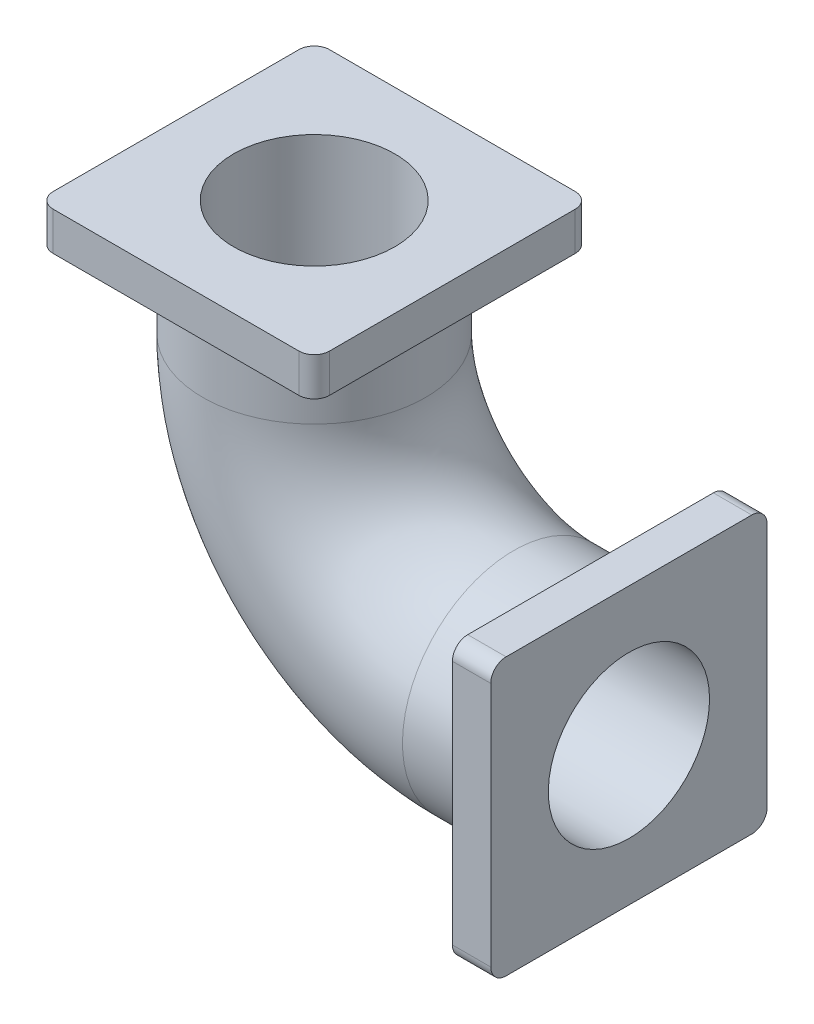
ISO-10303-21;
HEADER;
FILE_DESCRIPTION(('STEP AP214'),'2;1');
FILE_NAME('part.step','',(''),(''),'','','');
FILE_SCHEMA(('AUTOMOTIVE_DESIGN { 1 0 10303 214 1 1 1 1 }'));
ENDSEC;
DATA;
#1=APPLICATION_CONTEXT('core data for automotive mechanical design processes');
#2=APPLICATION_PROTOCOL_DEFINITION('international standard','automotive_design',2000,#1);
#3=PRODUCT_CONTEXT('',#1,'mechanical');
#4=PRODUCT('Part','Part','',(#3));
#5=PRODUCT_RELATED_PRODUCT_CATEGORY('part','',(#4));
#6=PRODUCT_DEFINITION_FORMATION('','',#4);
#7=PRODUCT_DEFINITION_CONTEXT('part definition',#1,'design');
#8=PRODUCT_DEFINITION('design','',#6,#7);
#9=PRODUCT_DEFINITION_SHAPE('','',#8);
#10=(LENGTH_UNIT() NAMED_UNIT(*) SI_UNIT(.MILLI.,.METRE.));
#11=(NAMED_UNIT(*) PLANE_ANGLE_UNIT() SI_UNIT($,.RADIAN.));
#12=(NAMED_UNIT(*) SI_UNIT($,.STERADIAN.) SOLID_ANGLE_UNIT());
#13=UNCERTAINTY_MEASURE_WITH_UNIT(LENGTH_MEASURE(1.E-05),#10,'distance_accuracy_value','');
#14=(GEOMETRIC_REPRESENTATION_CONTEXT(3) GLOBAL_UNCERTAINTY_ASSIGNED_CONTEXT((#13)) GLOBAL_UNIT_ASSIGNED_CONTEXT((#10,
#11,#12)) REPRESENTATION_CONTEXT('',''));
#15=CARTESIAN_POINT('',(0.,0.,0.));
#16=DIRECTION('',(0.,0.,1.));
#17=DIRECTION('',(1.,0.,0.));
#18=AXIS2_PLACEMENT_3D('',#15,#16,#17);
#19=CARTESIAN_POINT('',(-410.,260.,0.));
#20=DIRECTION('',(0.,1.,0.));
#21=DIRECTION('',(-1.,0.,0.));
#22=AXIS2_PLACEMENT_3D('',#19,#20,#21);
#23=CYLINDRICAL_SURFACE('',#22,145.);
#24=CARTESIAN_POINT('',(-410.,260.,0.));
#25=DIRECTION('',(0.,-1.,0.));
#26=DIRECTION('',(0.,0.,-1.));
#27=AXIS2_PLACEMENT_3D('',#24,#25,#26);
#28=CIRCLE('',#27,145.);
#29=CARTESIAN_POINT('',(-555.,260.,0.));
#30=VERTEX_POINT('',#29);
#31=EDGE_CURVE('E188',#30,#30,#28,.T.);
#32=ORIENTED_EDGE('',*,*,#31,.F.);
#33=EDGE_LOOP('',(#32));
#34=FACE_BOUND('',#33,.T.);
#35=CARTESIAN_POINT('',(-410.,360.,0.));
#36=DIRECTION('',(0.,1.,0.));
#37=DIRECTION('',(-1.,0.,0.));
#38=AXIS2_PLACEMENT_3D('',#35,#36,#37);
#39=CIRCLE('',#38,145.);
#40=CARTESIAN_POINT('',(-555.,360.,0.));
#41=VERTEX_POINT('',#40);
#42=EDGE_CURVE('E216',#41,#41,#39,.T.);
#43=ORIENTED_EDGE('',*,*,#42,.F.);
#44=EDGE_LOOP('',(#43));
#45=FACE_BOUND('',#44,.T.);
#46=ADVANCED_FACE('F41',(#34,#45),#23,.T.);
#47=CARTESIAN_POINT('',(0.,0.,0.));
#48=DIRECTION('',(-1.,0.,0.));
#49=DIRECTION('',(0.,0.,1.));
#50=AXIS2_PLACEMENT_3D('',#47,#48,#49);
#51=CYLINDRICAL_SURFACE('',#50,145.);
#52=CARTESIAN_POINT('',(-150.,0.,0.));
#53=DIRECTION('',(1.,0.,0.));
#54=DIRECTION('',(0.,0.,-1.));
#55=AXIS2_PLACEMENT_3D('',#52,#53,#54);
#56=CIRCLE('',#55,145.);
#57=CARTESIAN_POINT('',(-150.,-145.,0.));
#58=VERTEX_POINT('',#57);
#59=EDGE_CURVE('E310',#58,#58,#56,.T.);
#60=ORIENTED_EDGE('',*,*,#59,.T.);
#61=EDGE_LOOP('',(#60));
#62=FACE_BOUND('',#61,.T.);
#63=CARTESIAN_POINT('',(-50.,0.,0.));
#64=DIRECTION('',(1.,0.,0.));
#65=DIRECTION('',(0.,0.,-1.));
#66=AXIS2_PLACEMENT_3D('',#63,#64,#65);
#67=CIRCLE('',#66,145.);
#68=CARTESIAN_POINT('',(-50.,0.,-145.));
#69=VERTEX_POINT('',#68);
#70=EDGE_CURVE('E183',#69,#69,#67,.T.);
#71=ORIENTED_EDGE('',*,*,#70,.F.);
#72=EDGE_LOOP('',(#71));
#73=FACE_BOUND('',#72,.T.);
#74=ADVANCED_FACE('F320',(#62,#73),#51,.T.);
#75=CARTESIAN_POINT('',(0.,0.,0.));
#76=DIRECTION('',(1.,0.,0.));
#77=DIRECTION('',(0.,0.,-1.));
#78=AXIS2_PLACEMENT_3D('',#75,#76,#77);
#79=PLANE('',#78);
#80=CARTESIAN_POINT('',(0.,0.,0.));
#81=DIRECTION('',(1.,0.,0.));
#82=DIRECTION('',(0.,0.,-1.));
#83=AXIS2_PLACEMENT_3D('',#80,#81,#82);
#84=CIRCLE('',#83,105.);
#85=CARTESIAN_POINT('',(0.,0.,-105.));
#86=VERTEX_POINT('',#85);
#87=EDGE_CURVE('E291',#86,#86,#84,.T.);
#88=ORIENTED_EDGE('',*,*,#87,.F.);
#89=EDGE_LOOP('',(#88));
#90=FACE_BOUND('',#89,.T.);
#91=DIRECTION('',(0.,0.,-1.));
#92=VECTOR('',#91,1.);
#93=CARTESIAN_POINT('',(0.,-180.,0.));
#94=LINE('',#93,#92);
#95=CARTESIAN_POINT('',(0.,-180.,160.));
#96=VERTEX_POINT('',#95);
#97=CARTESIAN_POINT('',(0.,-180.,-160.));
#98=VERTEX_POINT('',#97);
#99=EDGE_CURVE('E159',#96,#98,#94,.T.);
#100=ORIENTED_EDGE('',*,*,#99,.T.);
#101=CARTESIAN_POINT('',(0.,-160.,-160.));
#102=DIRECTION('',(1.,0.,0.));
#103=DIRECTION('',(0.,0.,-1.));
#104=AXIS2_PLACEMENT_3D('',#101,#102,#103);
#105=CIRCLE('',#104,20.);
#106=CARTESIAN_POINT('',(0.,-160.,-180.));
#107=VERTEX_POINT('',#106);
#108=EDGE_CURVE('E166',#98,#107,#105,.T.);
#109=ORIENTED_EDGE('',*,*,#108,.T.);
#110=DIRECTION('',(0.,1.,0.));
#111=VECTOR('',#110,1.);
#112=CARTESIAN_POINT('',(0.,0.,-180.));
#113=LINE('',#112,#111);
#114=CARTESIAN_POINT('',(0.,160.,-180.));
#115=VERTEX_POINT('',#114);
#116=EDGE_CURVE('E177',#107,#115,#113,.T.);
#117=ORIENTED_EDGE('',*,*,#116,.T.);
#118=CARTESIAN_POINT('',(0.,160.,-160.));
#119=DIRECTION('',(1.,0.,0.));
#120=DIRECTION('',(0.,0.,-1.));
#121=AXIS2_PLACEMENT_3D('',#118,#119,#120);
#122=CIRCLE('',#121,20.);
#123=CARTESIAN_POINT('',(0.,180.,-160.));
#124=VERTEX_POINT('',#123);
#125=EDGE_CURVE('E167',#115,#124,#122,.T.);
#126=ORIENTED_EDGE('',*,*,#125,.T.);
#127=DIRECTION('',(0.,0.,-1.));
#128=VECTOR('',#127,1.);
#129=CARTESIAN_POINT('',(0.,180.,0.));
#130=LINE('',#129,#128);
#131=CARTESIAN_POINT('',(0.,180.,160.));
#132=VERTEX_POINT('',#131);
#133=EDGE_CURVE('E295',#132,#124,#130,.T.);
#134=ORIENTED_EDGE('',*,*,#133,.F.);
#135=CARTESIAN_POINT('',(0.,160.,160.));
#136=DIRECTION('',(1.,0.,0.));
#137=DIRECTION('',(0.,0.,-1.));
#138=AXIS2_PLACEMENT_3D('',#135,#136,#137);
#139=CIRCLE('',#138,20.);
#140=CARTESIAN_POINT('',(0.,160.,180.));
#141=VERTEX_POINT('',#140);
#142=EDGE_CURVE('E185',#132,#141,#139,.T.);
#143=ORIENTED_EDGE('',*,*,#142,.T.);
#144=DIRECTION('',(0.,1.,0.));
#145=VECTOR('',#144,1.);
#146=CARTESIAN_POINT('',(0.,0.,180.));
#147=LINE('',#146,#145);
#148=CARTESIAN_POINT('',(0.,-160.,180.));
#149=VERTEX_POINT('',#148);
#150=EDGE_CURVE('E161',#149,#141,#147,.T.);
#151=ORIENTED_EDGE('',*,*,#150,.F.);
#152=CARTESIAN_POINT('',(0.,-160.,160.));
#153=DIRECTION('',(1.,0.,0.));
#154=DIRECTION('',(0.,0.,-1.));
#155=AXIS2_PLACEMENT_3D('',#152,#153,#154);
#156=CIRCLE('',#155,20.);
#157=EDGE_CURVE('E156',#149,#96,#156,.T.);
#158=ORIENTED_EDGE('',*,*,#157,.T.);
#159=EDGE_LOOP('',(#100,#109,#117,#126,#134,#143,#151,#158));
#160=FACE_BOUND('',#159,.T.);
#161=ADVANCED_FACE('F158',(#90,#160),#79,.T.);
#162=CARTESIAN_POINT('',(-410.,410.,0.));
#163=DIRECTION('',(0.,-1.,0.));
#164=DIRECTION('',(0.,0.,-1.));
#165=AXIS2_PLACEMENT_3D('',#162,#163,#164);
#166=PLANE('',#165);
#167=CARTESIAN_POINT('',(-410.,410.,0.));
#168=DIRECTION('',(0.,-1.,0.));
#169=DIRECTION('',(1.,0.,0.));
#170=AXIS2_PLACEMENT_3D('',#167,#168,#169);
#171=CIRCLE('',#170,105.);
#172=CARTESIAN_POINT('',(-305.,410.,0.));
#173=VERTEX_POINT('',#172);
#174=EDGE_CURVE('E305',#173,#173,#171,.T.);
#175=ORIENTED_EDGE('',*,*,#174,.T.);
#176=EDGE_LOOP('',(#175));
#177=FACE_BOUND('',#176,.T.);
#178=DIRECTION('',(0.,0.,-1.));
#179=VECTOR('',#178,1.);
#180=CARTESIAN_POINT('',(-590.,410.,3.63906435849357E-13));
#181=LINE('',#180,#179);
#182=CARTESIAN_POINT('',(-590.,410.,160.));
#183=VERTEX_POINT('',#182);
#184=CARTESIAN_POINT('',(-590.,410.,-160.));
#185=VERTEX_POINT('',#184);
#186=EDGE_CURVE('E273',#183,#185,#181,.T.);
#187=ORIENTED_EDGE('',*,*,#186,.F.);
#188=CARTESIAN_POINT('',(-570.,410.,160.));
#189=DIRECTION('',(0.,-1.,0.));
#190=DIRECTION('',(1.,0.,0.));
#191=AXIS2_PLACEMENT_3D('',#188,#189,#190);
#192=CIRCLE('',#191,20.);
#193=CARTESIAN_POINT('',(-570.,410.,180.));
#194=VERTEX_POINT('',#193);
#195=EDGE_CURVE('E230',#183,#194,#192,.F.);
#196=ORIENTED_EDGE('',*,*,#195,.T.);
#197=DIRECTION('',(1.,0.,0.));
#198=VECTOR('',#197,1.);
#199=CARTESIAN_POINT('',(1.7235944623182E-13,410.,180.));
#200=LINE('',#199,#198);
#201=CARTESIAN_POINT('',(-250.,410.,180.));
#202=VERTEX_POINT('',#201);
#203=EDGE_CURVE('E271',#194,#202,#200,.T.);
#204=ORIENTED_EDGE('',*,*,#203,.T.);
#205=CARTESIAN_POINT('',(-250.,410.,160.));
#206=DIRECTION('',(0.,-1.,0.));
#207=DIRECTION('',(1.,0.,0.));
#208=AXIS2_PLACEMENT_3D('',#205,#206,#207);
#209=CIRCLE('',#208,20.);
#210=CARTESIAN_POINT('',(-230.,410.,160.));
#211=VERTEX_POINT('',#210);
#212=EDGE_CURVE('E228',#202,#211,#209,.F.);
#213=ORIENTED_EDGE('',*,*,#212,.T.);
#214=DIRECTION('',(0.,0.,-1.));
#215=VECTOR('',#214,1.);
#216=CARTESIAN_POINT('',(-230.,410.,0.));
#217=LINE('',#216,#215);
#218=CARTESIAN_POINT('',(-230.,410.,-160.));
#219=VERTEX_POINT('',#218);
#220=EDGE_CURVE('E266',#211,#219,#217,.T.);
#221=ORIENTED_EDGE('',*,*,#220,.T.);
#222=CARTESIAN_POINT('',(-250.,410.,-160.));
#223=DIRECTION('',(0.,-1.,0.));
#224=DIRECTION('',(1.,0.,0.));
#225=AXIS2_PLACEMENT_3D('',#222,#223,#224);
#226=CIRCLE('',#225,20.);
#227=CARTESIAN_POINT('',(-250.,410.,-180.));
#228=VERTEX_POINT('',#227);
#229=EDGE_CURVE('E224',#219,#228,#226,.F.);
#230=ORIENTED_EDGE('',*,*,#229,.T.);
#231=DIRECTION('',(1.,0.,0.));
#232=VECTOR('',#231,1.);
#233=CARTESIAN_POINT('',(1.7235944623182E-13,410.,-180.));
#234=LINE('',#233,#232);
#235=CARTESIAN_POINT('',(-570.,410.,-180.));
#236=VERTEX_POINT('',#235);
#237=EDGE_CURVE('E255',#236,#228,#234,.T.);
#238=ORIENTED_EDGE('',*,*,#237,.F.);
#239=CARTESIAN_POINT('',(-570.,410.,-160.));
#240=DIRECTION('',(0.,-1.,0.));
#241=DIRECTION('',(1.,0.,0.));
#242=AXIS2_PLACEMENT_3D('',#239,#240,#241);
#243=CIRCLE('',#242,20.);
#244=EDGE_CURVE('E226',#236,#185,#243,.F.);
#245=ORIENTED_EDGE('',*,*,#244,.T.);
#246=EDGE_LOOP('',(#187,#196,#204,#213,#221,#230,#238,#245));
#247=FACE_BOUND('',#246,.T.);
#248=ADVANCED_FACE('F269',(#177,#247),#166,.F.);
#249=CARTESIAN_POINT('',(-150.,260.,0.));
#250=DIRECTION('',(0.,0.,-1.));
#251=DIRECTION('',(-1.,0.,0.));
#252=AXIS2_PLACEMENT_3D('',#249,#250,#251);
#253=TOROIDAL_SURFACE('',#252,260.,145.);
#254=CARTESIAN_POINT('',(-150.,260.,0.));
#255=DIRECTION('',(0.,0.,-1.));
#256=DIRECTION('',(-1.,0.,0.));
#257=AXIS2_PLACEMENT_3D('',#254,#255,#256);
#258=CIRCLE('',#257,405.);
#259=EDGE_CURVE('',#58,#30,#258,.T.);
#260=ORIENTED_EDGE('',*,*,#59,.F.);
#261=ORIENTED_EDGE('',*,*,#31,.T.);
#262=ORIENTED_EDGE('',*,*,#259,.T.);
#263=ORIENTED_EDGE('',*,*,#259,.F.);
#264=EDGE_LOOP('',(#260,#262,#261,#263));
#265=FACE_BOUND('',#264,.T.);
#266=ADVANCED_FACE('F315',(#265),#253,.T.);
#267=CARTESIAN_POINT('',(0.,0.,0.));
#268=DIRECTION('',(-1.,0.,0.));
#269=DIRECTION('',(0.,0.,1.));
#270=AXIS2_PLACEMENT_3D('',#267,#268,#269);
#271=CYLINDRICAL_SURFACE('',#270,105.);
#272=CARTESIAN_POINT('',(-150.,0.,0.));
#273=DIRECTION('',(-1.,0.,0.));
#274=DIRECTION('',(0.,0.,1.));
#275=AXIS2_PLACEMENT_3D('',#272,#273,#274);
#276=CIRCLE('',#275,105.);
#277=CARTESIAN_POINT('',(-150.,-105.,0.));
#278=VERTEX_POINT('',#277);
#279=EDGE_CURVE('E299',#278,#278,#276,.F.);
#280=ORIENTED_EDGE('',*,*,#279,.F.);
#281=EDGE_LOOP('',(#280));
#282=FACE_BOUND('',#281,.T.);
#283=ORIENTED_EDGE('',*,*,#87,.T.);
#284=EDGE_LOOP('',(#283));
#285=FACE_BOUND('',#284,.T.);
#286=ADVANCED_FACE('F367',(#282,#285),#271,.F.);
#287=CARTESIAN_POINT('',(-150.,260.,0.));
#288=DIRECTION('',(0.,0.,-1.));
#289=DIRECTION('',(-1.,0.,0.));
#290=AXIS2_PLACEMENT_3D('',#287,#288,#289);
#291=TOROIDAL_SURFACE('',#290,260.,105.);
#292=CARTESIAN_POINT('',(-410.,260.,0.));
#293=DIRECTION('',(0.,-1.,0.));
#294=DIRECTION('',(0.,0.,-1.));
#295=AXIS2_PLACEMENT_3D('',#292,#293,#294);
#296=CIRCLE('',#295,105.);
#297=CARTESIAN_POINT('',(-515.,260.,0.));
#298=VERTEX_POINT('',#297);
#299=EDGE_CURVE('E302',#298,#298,#296,.T.);
#300=CARTESIAN_POINT('',(-150.,260.,0.));
#301=DIRECTION('',(0.,0.,-1.));
#302=DIRECTION('',(-1.,0.,0.));
#303=AXIS2_PLACEMENT_3D('',#300,#301,#302);
#304=CIRCLE('',#303,365.);
#305=EDGE_CURVE('',#278,#298,#304,.T.);
#306=ORIENTED_EDGE('',*,*,#279,.T.);
#307=ORIENTED_EDGE('',*,*,#299,.F.);
#308=ORIENTED_EDGE('',*,*,#305,.T.);
#309=ORIENTED_EDGE('',*,*,#305,.F.);
#310=EDGE_LOOP('',(#306,#308,#307,#309));
#311=FACE_BOUND('',#310,.T.);
#312=ADVANCED_FACE('F370',(#311),#291,.F.);
#313=CARTESIAN_POINT('',(-410.,260.,0.));
#314=DIRECTION('',(0.,1.,0.));
#315=DIRECTION('',(-1.,0.,0.));
#316=AXIS2_PLACEMENT_3D('',#313,#314,#315);
#317=CYLINDRICAL_SURFACE('',#316,105.);
#318=ORIENTED_EDGE('',*,*,#174,.F.);
#319=EDGE_LOOP('',(#318));
#320=FACE_BOUND('',#319,.T.);
#321=ORIENTED_EDGE('',*,*,#299,.T.);
#322=EDGE_LOOP('',(#321));
#323=FACE_BOUND('',#322,.T.);
#324=ADVANCED_FACE('F366',(#320,#323),#317,.F.);
#325=CARTESIAN_POINT('',(-50.,-180.,0.));
#326=DIRECTION('',(0.,-1.,0.));
#327=DIRECTION('',(0.,0.,-1.));
#328=AXIS2_PLACEMENT_3D('',#325,#326,#327);
#329=PLANE('',#328);
#330=DIRECTION('',(0.,0.,-1.));
#331=VECTOR('',#330,1.);
#332=CARTESIAN_POINT('',(-50.,-180.,0.));
#333=LINE('',#332,#331);
#334=CARTESIAN_POINT('',(-50.,-180.,160.));
#335=VERTEX_POINT('',#334);
#336=CARTESIAN_POINT('',(-50.,-180.,-160.));
#337=VERTEX_POINT('',#336);
#338=EDGE_CURVE('E281',#335,#337,#333,.T.);
#339=ORIENTED_EDGE('',*,*,#338,.T.);
#340=DIRECTION('',(1.,0.,0.));
#341=VECTOR('',#340,1.);
#342=CARTESIAN_POINT('',(-50.,-180.,-160.));
#343=LINE('',#342,#341);
#344=EDGE_CURVE('E176',#337,#98,#343,.T.);
#345=ORIENTED_EDGE('',*,*,#344,.T.);
#346=ORIENTED_EDGE('',*,*,#99,.F.);
#347=DIRECTION('',(1.,0.,0.));
#348=VECTOR('',#347,1.);
#349=CARTESIAN_POINT('',(-50.,-180.,160.));
#350=LINE('',#349,#348);
#351=EDGE_CURVE('E173',#96,#335,#350,.F.);
#352=ORIENTED_EDGE('',*,*,#351,.T.);
#353=EDGE_LOOP('',(#339,#345,#346,#352));
#354=FACE_BOUND('',#353,.T.);
#355=ADVANCED_FACE('F172',(#354),#329,.T.);
#356=CARTESIAN_POINT('',(-50.,0.,180.));
#357=DIRECTION('',(0.,0.,-1.));
#358=DIRECTION('',(-1.,0.,0.));
#359=AXIS2_PLACEMENT_3D('',#356,#357,#358);
#360=PLANE('',#359);
#361=DIRECTION('',(0.,1.,0.));
#362=VECTOR('',#361,1.);
#363=CARTESIAN_POINT('',(-50.,0.,180.));
#364=LINE('',#363,#362);
#365=CARTESIAN_POINT('',(-50.,-160.,180.));
#366=VERTEX_POINT('',#365);
#367=CARTESIAN_POINT('',(-50.,160.,180.));
#368=VERTEX_POINT('',#367);
#369=EDGE_CURVE('E289',#366,#368,#364,.T.);
#370=ORIENTED_EDGE('',*,*,#369,.F.);
#371=DIRECTION('',(1.,0.,0.));
#372=VECTOR('',#371,1.);
#373=CARTESIAN_POINT('',(0.,-160.,180.));
#374=LINE('',#373,#372);
#375=EDGE_CURVE('E209',#366,#149,#374,.T.);
#376=ORIENTED_EDGE('',*,*,#375,.T.);
#377=ORIENTED_EDGE('',*,*,#150,.T.);
#378=DIRECTION('',(1.,0.,0.));
#379=VECTOR('',#378,1.);
#380=CARTESIAN_POINT('',(-50.,160.,180.));
#381=LINE('',#380,#379);
#382=EDGE_CURVE('E207',#141,#368,#381,.F.);
#383=ORIENTED_EDGE('',*,*,#382,.T.);
#384=EDGE_LOOP('',(#370,#376,#377,#383));
#385=FACE_BOUND('',#384,.T.);
#386=ADVANCED_FACE('F353',(#385),#360,.F.);
#387=CARTESIAN_POINT('',(-50.,180.,0.));
#388=DIRECTION('',(0.,-1.,0.));
#389=DIRECTION('',(0.,0.,-1.));
#390=AXIS2_PLACEMENT_3D('',#387,#388,#389);
#391=PLANE('',#390);
#392=ORIENTED_EDGE('',*,*,#133,.T.);
#393=DIRECTION('',(1.,0.,0.));
#394=VECTOR('',#393,1.);
#395=CARTESIAN_POINT('',(-50.,180.,-160.));
#396=LINE('',#395,#394);
#397=CARTESIAN_POINT('',(-50.,180.,-160.));
#398=VERTEX_POINT('',#397);
#399=EDGE_CURVE('E214',#124,#398,#396,.F.);
#400=ORIENTED_EDGE('',*,*,#399,.T.);
#401=DIRECTION('',(0.,0.,-1.));
#402=VECTOR('',#401,1.);
#403=CARTESIAN_POINT('',(-50.,180.,0.));
#404=LINE('',#403,#402);
#405=CARTESIAN_POINT('',(-50.,180.,160.));
#406=VERTEX_POINT('',#405);
#407=EDGE_CURVE('E286',#406,#398,#404,.T.);
#408=ORIENTED_EDGE('',*,*,#407,.F.);
#409=DIRECTION('',(1.,0.,0.));
#410=VECTOR('',#409,1.);
#411=CARTESIAN_POINT('',(-50.,180.,160.));
#412=LINE('',#411,#410);
#413=EDGE_CURVE('E211',#406,#132,#412,.T.);
#414=ORIENTED_EDGE('',*,*,#413,.T.);
#415=EDGE_LOOP('',(#392,#400,#408,#414));
#416=FACE_BOUND('',#415,.T.);
#417=ADVANCED_FACE('F356',(#416),#391,.F.);
#418=CARTESIAN_POINT('',(-50.,0.,-180.));
#419=DIRECTION('',(0.,0.,-1.));
#420=DIRECTION('',(-1.,0.,0.));
#421=AXIS2_PLACEMENT_3D('',#418,#419,#420);
#422=PLANE('',#421);
#423=ORIENTED_EDGE('',*,*,#116,.F.);
#424=DIRECTION('',(1.,0.,0.));
#425=VECTOR('',#424,1.);
#426=CARTESIAN_POINT('',(-50.,-160.,-180.));
#427=LINE('',#426,#425);
#428=CARTESIAN_POINT('',(-50.,-160.,-180.));
#429=VERTEX_POINT('',#428);
#430=EDGE_CURVE('E198',#107,#429,#427,.F.);
#431=ORIENTED_EDGE('',*,*,#430,.T.);
#432=DIRECTION('',(0.,1.,0.));
#433=VECTOR('',#432,1.);
#434=CARTESIAN_POINT('',(-50.,0.,-180.));
#435=LINE('',#434,#433);
#436=CARTESIAN_POINT('',(-50.,160.,-180.));
#437=VERTEX_POINT('',#436);
#438=EDGE_CURVE('E283',#429,#437,#435,.T.);
#439=ORIENTED_EDGE('',*,*,#438,.T.);
#440=DIRECTION('',(1.,0.,0.));
#441=VECTOR('',#440,1.);
#442=CARTESIAN_POINT('',(0.,160.,-180.));
#443=LINE('',#442,#441);
#444=EDGE_CURVE('E195',#437,#115,#443,.T.);
#445=ORIENTED_EDGE('',*,*,#444,.T.);
#446=EDGE_LOOP('',(#423,#431,#439,#445));
#447=FACE_BOUND('',#446,.T.);
#448=ADVANCED_FACE('F351',(#447),#422,.T.);
#449=CARTESIAN_POINT('',(-50.,0.,0.));
#450=DIRECTION('',(1.,0.,0.));
#451=DIRECTION('',(0.,0.,-1.));
#452=AXIS2_PLACEMENT_3D('',#449,#450,#451);
#453=PLANE('',#452);
#454=ORIENTED_EDGE('',*,*,#70,.T.);
#455=EDGE_LOOP('',(#454));
#456=FACE_BOUND('',#455,.T.);
#457=ORIENTED_EDGE('',*,*,#438,.F.);
#458=CARTESIAN_POINT('',(-50.,-160.,-160.));
#459=DIRECTION('',(1.,0.,0.));
#460=DIRECTION('',(0.,0.,-1.));
#461=AXIS2_PLACEMENT_3D('',#458,#459,#460);
#462=CIRCLE('',#461,20.);
#463=EDGE_CURVE('E205',#429,#337,#462,.F.);
#464=ORIENTED_EDGE('',*,*,#463,.T.);
#465=ORIENTED_EDGE('',*,*,#338,.F.);
#466=CARTESIAN_POINT('',(-50.,-160.,160.));
#467=DIRECTION('',(1.,0.,0.));
#468=DIRECTION('',(0.,0.,-1.));
#469=AXIS2_PLACEMENT_3D('',#466,#467,#468);
#470=CIRCLE('',#469,20.);
#471=EDGE_CURVE('E182',#335,#366,#470,.F.);
#472=ORIENTED_EDGE('',*,*,#471,.T.);
#473=ORIENTED_EDGE('',*,*,#369,.T.);
#474=CARTESIAN_POINT('',(-50.,160.,160.));
#475=DIRECTION('',(1.,0.,0.));
#476=DIRECTION('',(0.,0.,-1.));
#477=AXIS2_PLACEMENT_3D('',#474,#475,#476);
#478=CIRCLE('',#477,20.);
#479=EDGE_CURVE('E200',#368,#406,#478,.F.);
#480=ORIENTED_EDGE('',*,*,#479,.T.);
#481=ORIENTED_EDGE('',*,*,#407,.T.);
#482=CARTESIAN_POINT('',(-50.,160.,-160.));
#483=DIRECTION('',(1.,0.,0.));
#484=DIRECTION('',(0.,0.,-1.));
#485=AXIS2_PLACEMENT_3D('',#482,#483,#484);
#486=CIRCLE('',#485,20.);
#487=EDGE_CURVE('E202',#398,#437,#486,.F.);
#488=ORIENTED_EDGE('',*,*,#487,.T.);
#489=EDGE_LOOP('',(#457,#464,#465,#472,#473,#480,#481,#488));
#490=FACE_BOUND('',#489,.T.);
#491=ADVANCED_FACE('F347',(#456,#490),#453,.F.);
#492=CARTESIAN_POINT('',(-50.,-160.,-160.));
#493=DIRECTION('',(1.,0.,0.));
#494=DIRECTION('',(0.,0.,-1.));
#495=AXIS2_PLACEMENT_3D('',#492,#493,#494);
#496=CYLINDRICAL_SURFACE('',#495,20.);
#497=ORIENTED_EDGE('',*,*,#463,.F.);
#498=ORIENTED_EDGE('',*,*,#430,.F.);
#499=ORIENTED_EDGE('',*,*,#108,.F.);
#500=ORIENTED_EDGE('',*,*,#344,.F.);
#501=EDGE_LOOP('',(#497,#498,#499,#500));
#502=FACE_BOUND('',#501,.T.);
#503=ADVANCED_FACE('F350',(#502),#496,.T.);
#504=CARTESIAN_POINT('',(-50.,-160.,160.));
#505=DIRECTION('',(-1.,0.,0.));
#506=DIRECTION('',(0.,0.,1.));
#507=AXIS2_PLACEMENT_3D('',#504,#505,#506);
#508=CYLINDRICAL_SURFACE('',#507,20.);
#509=ORIENTED_EDGE('',*,*,#471,.F.);
#510=ORIENTED_EDGE('',*,*,#351,.F.);
#511=ORIENTED_EDGE('',*,*,#157,.F.);
#512=ORIENTED_EDGE('',*,*,#375,.F.);
#513=EDGE_LOOP('',(#509,#510,#511,#512));
#514=FACE_BOUND('',#513,.T.);
#515=ADVANCED_FACE('F181',(#514),#508,.T.);
#516=CARTESIAN_POINT('',(-50.,160.,-160.));
#517=DIRECTION('',(-1.,0.,0.));
#518=DIRECTION('',(0.,0.,1.));
#519=AXIS2_PLACEMENT_3D('',#516,#517,#518);
#520=CYLINDRICAL_SURFACE('',#519,20.);
#521=ORIENTED_EDGE('',*,*,#487,.F.);
#522=ORIENTED_EDGE('',*,*,#399,.F.);
#523=ORIENTED_EDGE('',*,*,#125,.F.);
#524=ORIENTED_EDGE('',*,*,#444,.F.);
#525=EDGE_LOOP('',(#521,#522,#523,#524));
#526=FACE_BOUND('',#525,.T.);
#527=ADVANCED_FACE('F394',(#526),#520,.T.);
#528=CARTESIAN_POINT('',(-50.,160.,160.));
#529=DIRECTION('',(1.,0.,0.));
#530=DIRECTION('',(0.,0.,-1.));
#531=AXIS2_PLACEMENT_3D('',#528,#529,#530);
#532=CYLINDRICAL_SURFACE('',#531,20.);
#533=ORIENTED_EDGE('',*,*,#479,.F.);
#534=ORIENTED_EDGE('',*,*,#382,.F.);
#535=ORIENTED_EDGE('',*,*,#142,.F.);
#536=ORIENTED_EDGE('',*,*,#413,.F.);
#537=EDGE_LOOP('',(#533,#534,#535,#536));
#538=FACE_BOUND('',#537,.T.);
#539=ADVANCED_FACE('F345',(#538),#532,.T.);
#540=CARTESIAN_POINT('',(1.53855729154734E-13,360.,180.));
#541=DIRECTION('',(0.,0.,1.));
#542=DIRECTION('',(1.,0.,0.));
#543=AXIS2_PLACEMENT_3D('',#540,#541,#542);
#544=PLANE('',#543);
#545=ORIENTED_EDGE('',*,*,#203,.F.);
#546=DIRECTION('',(0.,1.,0.));
#547=VECTOR('',#546,1.);
#548=CARTESIAN_POINT('',(-570.,360.,180.));
#549=LINE('',#548,#547);
#550=CARTESIAN_POINT('',(-570.,360.,180.));
#551=VERTEX_POINT('',#550);
#552=EDGE_CURVE('E235',#194,#551,#549,.F.);
#553=ORIENTED_EDGE('',*,*,#552,.T.);
#554=DIRECTION('',(1.,0.,0.));
#555=VECTOR('',#554,1.);
#556=CARTESIAN_POINT('',(1.53855729154734E-13,360.,180.));
#557=LINE('',#556,#555);
#558=CARTESIAN_POINT('',(-250.,360.,180.));
#559=VERTEX_POINT('',#558);
#560=EDGE_CURVE('E280',#551,#559,#557,.T.);
#561=ORIENTED_EDGE('',*,*,#560,.T.);
#562=DIRECTION('',(0.,1.,0.));
#563=VECTOR('',#562,1.);
#564=CARTESIAN_POINT('',(-250.,360.,180.));
#565=LINE('',#564,#563);
#566=EDGE_CURVE('E232',#559,#202,#565,.T.);
#567=ORIENTED_EDGE('',*,*,#566,.T.);
#568=EDGE_LOOP('',(#545,#553,#561,#567));
#569=FACE_BOUND('',#568,.T.);
#570=ADVANCED_FACE('F339',(#569),#544,.T.);
#571=CARTESIAN_POINT('',(-590.,360.,3.63906435849357E-13));
#572=DIRECTION('',(1.,0.,0.));
#573=DIRECTION('',(0.,0.,-1.));
#574=AXIS2_PLACEMENT_3D('',#571,#572,#573);
#575=PLANE('',#574);
#576=DIRECTION('',(0.,0.,-1.));
#577=VECTOR('',#576,1.);
#578=CARTESIAN_POINT('',(-590.,360.,3.63906435849357E-13));
#579=LINE('',#578,#577);
#580=CARTESIAN_POINT('',(-590.,360.,160.));
#581=VERTEX_POINT('',#580);
#582=CARTESIAN_POINT('',(-590.,360.,-160.));
#583=VERTEX_POINT('',#582);
#584=EDGE_CURVE('E178',#581,#583,#579,.T.);
#585=ORIENTED_EDGE('',*,*,#584,.F.);
#586=DIRECTION('',(0.,1.,0.));
#587=VECTOR('',#586,1.);
#588=CARTESIAN_POINT('',(-590.,410.,160.));
#589=LINE('',#588,#587);
#590=EDGE_CURVE('E221',#581,#183,#589,.T.);
#591=ORIENTED_EDGE('',*,*,#590,.T.);
#592=ORIENTED_EDGE('',*,*,#186,.T.);
#593=DIRECTION('',(0.,1.,0.));
#594=VECTOR('',#593,1.);
#595=CARTESIAN_POINT('',(-590.,360.,-160.));
#596=LINE('',#595,#594);
#597=EDGE_CURVE('E219',#185,#583,#596,.F.);
#598=ORIENTED_EDGE('',*,*,#597,.T.);
#599=EDGE_LOOP('',(#585,#591,#592,#598));
#600=FACE_BOUND('',#599,.T.);
#601=ADVANCED_FACE('F336',(#600),#575,.F.);
#602=CARTESIAN_POINT('',(1.53855729154734E-13,360.,-180.));
#603=DIRECTION('',(0.,0.,1.));
#604=DIRECTION('',(1.,0.,0.));
#605=AXIS2_PLACEMENT_3D('',#602,#603,#604);
#606=PLANE('',#605);
#607=DIRECTION('',(1.,0.,0.));
#608=VECTOR('',#607,1.);
#609=CARTESIAN_POINT('',(1.53855729154734E-13,360.,-180.));
#610=LINE('',#609,#608);
#611=CARTESIAN_POINT('',(-570.,360.,-180.));
#612=VERTEX_POINT('',#611);
#613=CARTESIAN_POINT('',(-250.,360.,-180.));
#614=VERTEX_POINT('',#613);
#615=EDGE_CURVE('E252',#612,#614,#610,.T.);
#616=ORIENTED_EDGE('',*,*,#615,.F.);
#617=DIRECTION('',(0.,1.,0.));
#618=VECTOR('',#617,1.);
#619=CARTESIAN_POINT('',(-570.,360.,-180.));
#620=LINE('',#619,#618);
#621=EDGE_CURVE('E11',#612,#236,#620,.T.);
#622=ORIENTED_EDGE('',*,*,#621,.T.);
#623=ORIENTED_EDGE('',*,*,#237,.T.);
#624=DIRECTION('',(0.,1.,0.));
#625=VECTOR('',#624,1.);
#626=CARTESIAN_POINT('',(-250.,360.,-180.));
#627=LINE('',#626,#625);
#628=EDGE_CURVE('E49',#228,#614,#627,.F.);
#629=ORIENTED_EDGE('',*,*,#628,.T.);
#630=EDGE_LOOP('',(#616,#622,#623,#629));
#631=FACE_BOUND('',#630,.T.);
#632=ADVANCED_FACE('F251',(#631),#606,.F.);
#633=CARTESIAN_POINT('',(-230.,360.,0.));
#634=DIRECTION('',(1.,0.,0.));
#635=DIRECTION('',(0.,1.,0.));
#636=AXIS2_PLACEMENT_3D('',#633,#634,#635);
#637=PLANE('',#636);
#638=ORIENTED_EDGE('',*,*,#220,.F.);
#639=DIRECTION('',(0.,1.,0.));
#640=VECTOR('',#639,1.);
#641=CARTESIAN_POINT('',(-230.,360.,160.));
#642=LINE('',#641,#640);
#643=CARTESIAN_POINT('',(-230.,360.,160.));
#644=VERTEX_POINT('',#643);
#645=EDGE_CURVE('E63',#211,#644,#642,.F.);
#646=ORIENTED_EDGE('',*,*,#645,.T.);
#647=DIRECTION('',(0.,0.,-1.));
#648=VECTOR('',#647,1.);
#649=CARTESIAN_POINT('',(-230.,360.,0.));
#650=LINE('',#649,#648);
#651=CARTESIAN_POINT('',(-230.,360.,-160.));
#652=VERTEX_POINT('',#651);
#653=EDGE_CURVE('E261',#644,#652,#650,.T.);
#654=ORIENTED_EDGE('',*,*,#653,.T.);
#655=DIRECTION('',(0.,1.,0.));
#656=VECTOR('',#655,1.);
#657=CARTESIAN_POINT('',(-230.,410.,-160.));
#658=LINE('',#657,#656);
#659=EDGE_CURVE('E244',#652,#219,#658,.T.);
#660=ORIENTED_EDGE('',*,*,#659,.T.);
#661=EDGE_LOOP('',(#638,#646,#654,#660));
#662=FACE_BOUND('',#661,.T.);
#663=ADVANCED_FACE('F265',(#662),#637,.T.);
#664=CARTESIAN_POINT('',(1.53855729154734E-13,360.,0.));
#665=DIRECTION('',(0.,1.,0.));
#666=DIRECTION('',(-1.,0.,0.));
#667=AXIS2_PLACEMENT_3D('',#664,#665,#666);
#668=PLANE('',#667);
#669=ORIENTED_EDGE('',*,*,#42,.T.);
#670=EDGE_LOOP('',(#669));
#671=FACE_BOUND('',#670,.T.);
#672=ORIENTED_EDGE('',*,*,#560,.F.);
#673=CARTESIAN_POINT('',(-570.,360.,160.));
#674=DIRECTION('',(0.,1.,0.));
#675=DIRECTION('',(-1.,0.,0.));
#676=AXIS2_PLACEMENT_3D('',#673,#674,#675);
#677=CIRCLE('',#676,20.);
#678=EDGE_CURVE('E242',#551,#581,#677,.F.);
#679=ORIENTED_EDGE('',*,*,#678,.T.);
#680=ORIENTED_EDGE('',*,*,#584,.T.);
#681=CARTESIAN_POINT('',(-570.,360.,-160.));
#682=DIRECTION('',(0.,1.,0.));
#683=DIRECTION('',(-1.,0.,0.));
#684=AXIS2_PLACEMENT_3D('',#681,#682,#683);
#685=CIRCLE('',#684,20.);
#686=EDGE_CURVE('E238',#583,#612,#685,.F.);
#687=ORIENTED_EDGE('',*,*,#686,.T.);
#688=ORIENTED_EDGE('',*,*,#615,.T.);
#689=CARTESIAN_POINT('',(-250.,360.,-160.));
#690=DIRECTION('',(0.,1.,0.));
#691=DIRECTION('',(-1.,0.,0.));
#692=AXIS2_PLACEMENT_3D('',#689,#690,#691);
#693=CIRCLE('',#692,20.);
#694=EDGE_CURVE('E56',#614,#652,#693,.F.);
#695=ORIENTED_EDGE('',*,*,#694,.T.);
#696=ORIENTED_EDGE('',*,*,#653,.F.);
#697=CARTESIAN_POINT('',(-250.,360.,160.));
#698=DIRECTION('',(0.,1.,0.));
#699=DIRECTION('',(-1.,0.,0.));
#700=AXIS2_PLACEMENT_3D('',#697,#698,#699);
#701=CIRCLE('',#700,20.);
#702=EDGE_CURVE('E240',#644,#559,#701,.F.);
#703=ORIENTED_EDGE('',*,*,#702,.T.);
#704=EDGE_LOOP('',(#672,#679,#680,#687,#688,#695,#696,#703));
#705=FACE_BOUND('',#704,.T.);
#706=ADVANCED_FACE('F258',(#671,#705),#668,.F.);
#707=CARTESIAN_POINT('',(-570.,360.,160.));
#708=DIRECTION('',(0.,-1.,0.));
#709=DIRECTION('',(1.,0.,0.));
#710=AXIS2_PLACEMENT_3D('',#707,#708,#709);
#711=CYLINDRICAL_SURFACE('',#710,20.);
#712=ORIENTED_EDGE('',*,*,#678,.F.);
#713=ORIENTED_EDGE('',*,*,#552,.F.);
#714=ORIENTED_EDGE('',*,*,#195,.F.);
#715=ORIENTED_EDGE('',*,*,#590,.F.);
#716=EDGE_LOOP('',(#712,#713,#714,#715));
#717=FACE_BOUND('',#716,.T.);
#718=ADVANCED_FACE('F325',(#717),#711,.T.);
#719=CARTESIAN_POINT('',(-250.,360.,160.));
#720=DIRECTION('',(0.,1.,0.));
#721=DIRECTION('',(-1.,0.,0.));
#722=AXIS2_PLACEMENT_3D('',#719,#720,#721);
#723=CYLINDRICAL_SURFACE('',#722,20.);
#724=ORIENTED_EDGE('',*,*,#702,.F.);
#725=ORIENTED_EDGE('',*,*,#645,.F.);
#726=ORIENTED_EDGE('',*,*,#212,.F.);
#727=ORIENTED_EDGE('',*,*,#566,.F.);
#728=EDGE_LOOP('',(#724,#725,#726,#727));
#729=FACE_BOUND('',#728,.T.);
#730=ADVANCED_FACE('F331',(#729),#723,.T.);
#731=CARTESIAN_POINT('',(-570.,360.,-160.));
#732=DIRECTION('',(0.,1.,0.));
#733=DIRECTION('',(-1.,0.,0.));
#734=AXIS2_PLACEMENT_3D('',#731,#732,#733);
#735=CYLINDRICAL_SURFACE('',#734,20.);
#736=ORIENTED_EDGE('',*,*,#686,.F.);
#737=ORIENTED_EDGE('',*,*,#597,.F.);
#738=ORIENTED_EDGE('',*,*,#244,.F.);
#739=ORIENTED_EDGE('',*,*,#621,.F.);
#740=EDGE_LOOP('',(#736,#737,#738,#739));
#741=FACE_BOUND('',#740,.T.);
#742=ADVANCED_FACE('F402',(#741),#735,.T.);
#743=CARTESIAN_POINT('',(-250.,360.,-160.));
#744=DIRECTION('',(0.,-1.,0.));
#745=DIRECTION('',(1.,0.,0.));
#746=AXIS2_PLACEMENT_3D('',#743,#744,#745);
#747=CYLINDRICAL_SURFACE('',#746,20.);
#748=ORIENTED_EDGE('',*,*,#694,.F.);
#749=ORIENTED_EDGE('',*,*,#628,.F.);
#750=ORIENTED_EDGE('',*,*,#229,.F.);
#751=ORIENTED_EDGE('',*,*,#659,.F.);
#752=EDGE_LOOP('',(#748,#749,#750,#751));
#753=FACE_BOUND('',#752,.T.);
#754=ADVANCED_FACE('F43',(#753),#747,.T.);
#755=CLOSED_SHELL('',(#46,#74,#161,#248,#266,#286,#312,#324,#355,#386,#417,#448,#491,#503,#515,
#527,#539,#570,#601,#632,#663,#706,#718,#730,#742,#754));
#756=MANIFOLD_SOLID_BREP('B2',#755);
#757=ADVANCED_BREP_SHAPE_REPRESENTATION('',(#18,#756),#14);
#758=SHAPE_DEFINITION_REPRESENTATION(#9,#757);
ENDSEC;
END-ISO-10303-21;
